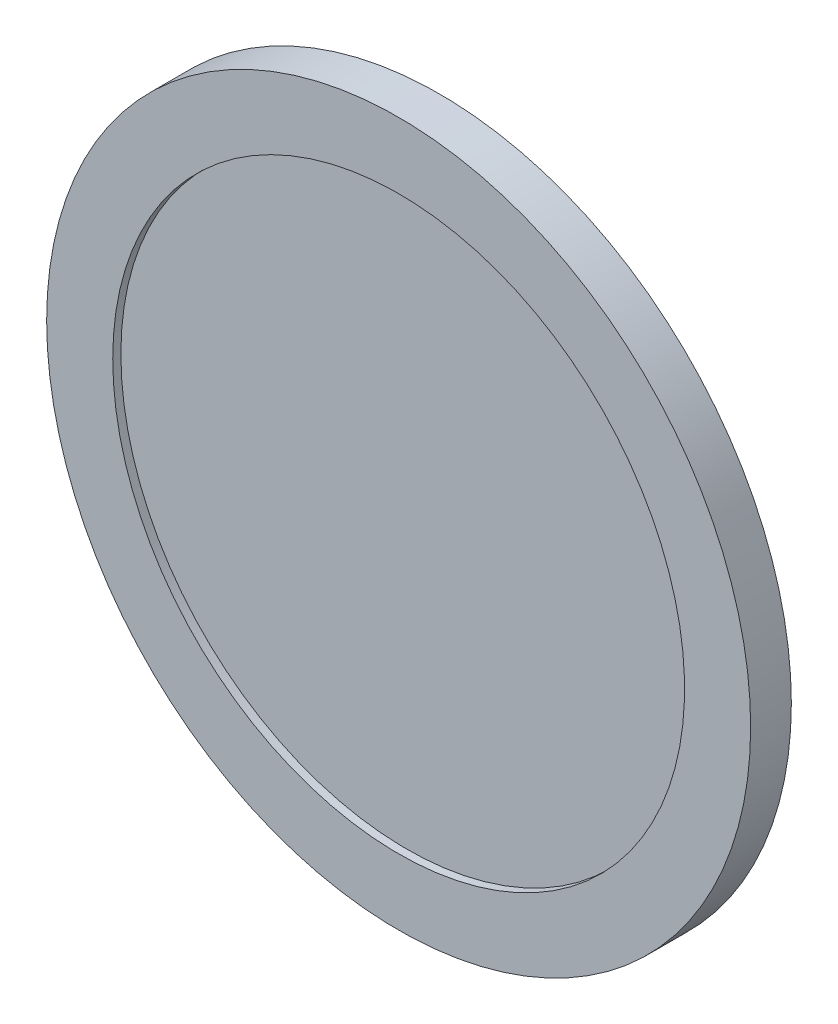
ISO-10303-21;
HEADER;
FILE_DESCRIPTION(('STEP AP214'),'2;1');
FILE_NAME('part.step','',(''),(''),'','','');
FILE_SCHEMA(('AUTOMOTIVE_DESIGN { 1 0 10303 214 1 1 1 1 }'));
ENDSEC;
DATA;
#1=APPLICATION_CONTEXT('core data for automotive mechanical design processes');
#2=APPLICATION_PROTOCOL_DEFINITION('international standard','automotive_design',2000,#1);
#3=PRODUCT_CONTEXT('',#1,'mechanical');
#4=PRODUCT('Part','Part','',(#3));
#5=PRODUCT_RELATED_PRODUCT_CATEGORY('part','',(#4));
#6=PRODUCT_DEFINITION_FORMATION('','',#4);
#7=PRODUCT_DEFINITION_CONTEXT('part definition',#1,'design');
#8=PRODUCT_DEFINITION('design','',#6,#7);
#9=PRODUCT_DEFINITION_SHAPE('','',#8);
#10=(LENGTH_UNIT() NAMED_UNIT(*) SI_UNIT(.MILLI.,.METRE.));
#11=(NAMED_UNIT(*) PLANE_ANGLE_UNIT() SI_UNIT($,.RADIAN.));
#12=(NAMED_UNIT(*) SI_UNIT($,.STERADIAN.) SOLID_ANGLE_UNIT());
#13=UNCERTAINTY_MEASURE_WITH_UNIT(LENGTH_MEASURE(1.E-05),#10,'distance_accuracy_value','');
#14=(GEOMETRIC_REPRESENTATION_CONTEXT(3) GLOBAL_UNCERTAINTY_ASSIGNED_CONTEXT((#13)) GLOBAL_UNIT_ASSIGNED_CONTEXT((#10,
#11,#12)) REPRESENTATION_CONTEXT('',''));
#15=CARTESIAN_POINT('',(0.,0.,0.));
#16=DIRECTION('',(0.,0.,1.));
#17=DIRECTION('',(1.,0.,0.));
#18=AXIS2_PLACEMENT_3D('',#15,#16,#17);
#19=CARTESIAN_POINT('',(0.,0.,0.));
#20=DIRECTION('',(0.,0.,1.));
#21=DIRECTION('',(1.,0.,0.));
#22=AXIS2_PLACEMENT_3D('',#19,#20,#21);
#23=PLANE('',#22);
#24=CARTESIAN_POINT('',(0.,0.,0.));
#25=DIRECTION('',(0.,0.,-1.));
#26=DIRECTION('',(-1.,0.,0.));
#27=AXIS2_PLACEMENT_3D('',#24,#25,#26);
#28=CIRCLE('',#27,70.2607254613995);
#29=CARTESIAN_POINT('',(-70.2607254613995,0.,0.));
#30=VERTEX_POINT('',#29);
#31=EDGE_CURVE('E10',#30,#30,#28,.T.);
#32=ORIENTED_EDGE('',*,*,#31,.F.);
#33=EDGE_LOOP('',(#32));
#34=FACE_BOUND('',#33,.T.);
#35=ADVANCED_FACE('F31',(#34),#23,.T.);
#36=CARTESIAN_POINT('',(0.,0.,-6.));
#37=DIRECTION('',(0.,0.,-1.));
#38=DIRECTION('',(-1.,0.,0.));
#39=AXIS2_PLACEMENT_3D('',#36,#37,#38);
#40=CYLINDRICAL_SURFACE('',#39,70.2607254613995);
#41=ORIENTED_EDGE('',*,*,#31,.T.);
#42=EDGE_LOOP('',(#41));
#43=FACE_BOUND('',#42,.T.);
#44=CARTESIAN_POINT('',(0.,0.,2.));
#45=DIRECTION('',(0.,0.,-1.));
#46=DIRECTION('',(-1.,0.,0.));
#47=AXIS2_PLACEMENT_3D('',#44,#45,#46);
#48=CIRCLE('',#47,70.2607254613995);
#49=CARTESIAN_POINT('',(-70.2607254613995,0.,2.));
#50=VERTEX_POINT('',#49);
#51=EDGE_CURVE('E37',#50,#50,#48,.T.);
#52=ORIENTED_EDGE('',*,*,#51,.F.);
#53=EDGE_LOOP('',(#52));
#54=FACE_BOUND('',#53,.T.);
#55=ADVANCED_FACE('F73',(#43,#54),#40,.F.);
#56=CARTESIAN_POINT('',(0.,70.2607254613995,2.));
#57=DIRECTION('',(0.,0.,1.));
#58=DIRECTION('',(1.,0.,0.));
#59=AXIS2_PLACEMENT_3D('',#56,#57,#58);
#60=PLANE('',#59);
#61=ORIENTED_EDGE('',*,*,#51,.T.);
#62=EDGE_LOOP('',(#61));
#63=FACE_BOUND('',#62,.T.);
#64=CARTESIAN_POINT('',(0.,0.,2.));
#65=DIRECTION('',(0.,0.,-1.));
#66=DIRECTION('',(-1.,0.,0.));
#67=AXIS2_PLACEMENT_3D('',#64,#65,#66);
#68=CIRCLE('',#67,86.5);
#69=CARTESIAN_POINT('',(-86.5,0.,2.));
#70=VERTEX_POINT('',#69);
#71=EDGE_CURVE('E41',#70,#70,#68,.T.);
#72=ORIENTED_EDGE('',*,*,#71,.F.);
#73=EDGE_LOOP('',(#72));
#74=FACE_BOUND('',#73,.T.);
#75=ADVANCED_FACE('F78',(#63,#74),#60,.T.);
#76=CARTESIAN_POINT('',(0.,0.,-6.));
#77=DIRECTION('',(0.,0.,-1.));
#78=DIRECTION('',(-1.,0.,0.));
#79=AXIS2_PLACEMENT_3D('',#76,#77,#78);
#80=CYLINDRICAL_SURFACE('',#79,86.5);
#81=ORIENTED_EDGE('',*,*,#71,.T.);
#82=EDGE_LOOP('',(#81));
#83=FACE_BOUND('',#82,.T.);
#84=CARTESIAN_POINT('',(0.,0.,-8.));
#85=DIRECTION('',(0.,0.,-1.));
#86=DIRECTION('',(-1.,0.,0.));
#87=AXIS2_PLACEMENT_3D('',#84,#85,#86);
#88=CIRCLE('',#87,86.5);
#89=CARTESIAN_POINT('',(-86.5,0.,-8.));
#90=VERTEX_POINT('',#89);
#91=EDGE_CURVE('E45',#90,#90,#88,.T.);
#92=ORIENTED_EDGE('',*,*,#91,.F.);
#93=EDGE_LOOP('',(#92));
#94=FACE_BOUND('',#93,.T.);
#95=ADVANCED_FACE('F69',(#83,#94),#80,.T.);
#96=CARTESIAN_POINT('',(0.,86.5,-8.));
#97=DIRECTION('',(0.,0.,-1.));
#98=DIRECTION('',(-1.,0.,0.));
#99=AXIS2_PLACEMENT_3D('',#96,#97,#98);
#100=PLANE('',#99);
#101=ORIENTED_EDGE('',*,*,#91,.T.);
#102=EDGE_LOOP('',(#101));
#103=FACE_BOUND('',#102,.T.);
#104=CARTESIAN_POINT('',(0.,0.,-8.));
#105=DIRECTION('',(0.,0.,-1.));
#106=DIRECTION('',(-1.,0.,0.));
#107=AXIS2_PLACEMENT_3D('',#104,#105,#106);
#108=CIRCLE('',#107,70.2607254613995);
#109=CARTESIAN_POINT('',(-70.2607254613995,0.,-8.));
#110=VERTEX_POINT('',#109);
#111=EDGE_CURVE('E50',#110,#110,#108,.T.);
#112=ORIENTED_EDGE('',*,*,#111,.F.);
#113=EDGE_LOOP('',(#112));
#114=FACE_BOUND('',#113,.T.);
#115=ADVANCED_FACE('F61',(#103,#114),#100,.T.);
#116=CARTESIAN_POINT('',(0.,0.,-6.));
#117=DIRECTION('',(0.,0.,-1.));
#118=DIRECTION('',(-1.,0.,0.));
#119=AXIS2_PLACEMENT_3D('',#116,#117,#118);
#120=CYLINDRICAL_SURFACE('',#119,70.2607254613995);
#121=ORIENTED_EDGE('',*,*,#111,.T.);
#122=EDGE_LOOP('',(#121));
#123=FACE_BOUND('',#122,.T.);
#124=CARTESIAN_POINT('',(0.,0.,-6.));
#125=DIRECTION('',(0.,0.,-1.));
#126=DIRECTION('',(-1.,0.,0.));
#127=AXIS2_PLACEMENT_3D('',#124,#125,#126);
#128=CIRCLE('',#127,70.2607254613995);
#129=CARTESIAN_POINT('',(-70.2607254613995,0.,-6.));
#130=VERTEX_POINT('',#129);
#131=EDGE_CURVE('E53',#130,#130,#128,.T.);
#132=ORIENTED_EDGE('',*,*,#131,.F.);
#133=EDGE_LOOP('',(#132));
#134=FACE_BOUND('',#133,.T.);
#135=ADVANCED_FACE('F59',(#123,#134),#120,.F.);
#136=CARTESIAN_POINT('',(0.,70.2607254613995,-6.));
#137=DIRECTION('',(0.,0.,-1.));
#138=DIRECTION('',(-1.,0.,0.));
#139=AXIS2_PLACEMENT_3D('',#136,#137,#138);
#140=PLANE('',#139);
#141=ORIENTED_EDGE('',*,*,#131,.T.);
#142=EDGE_LOOP('',(#141));
#143=FACE_BOUND('',#142,.T.);
#144=ADVANCED_FACE('F57',(#143),#140,.T.);
#145=CLOSED_SHELL('',(#35,#55,#75,#95,#115,#135,#144));
#146=MANIFOLD_SOLID_BREP('B2',#145);
#147=ADVANCED_BREP_SHAPE_REPRESENTATION('',(#18,#146),#14);
#148=SHAPE_DEFINITION_REPRESENTATION(#9,#147);
ENDSEC;
END-ISO-10303-21;
